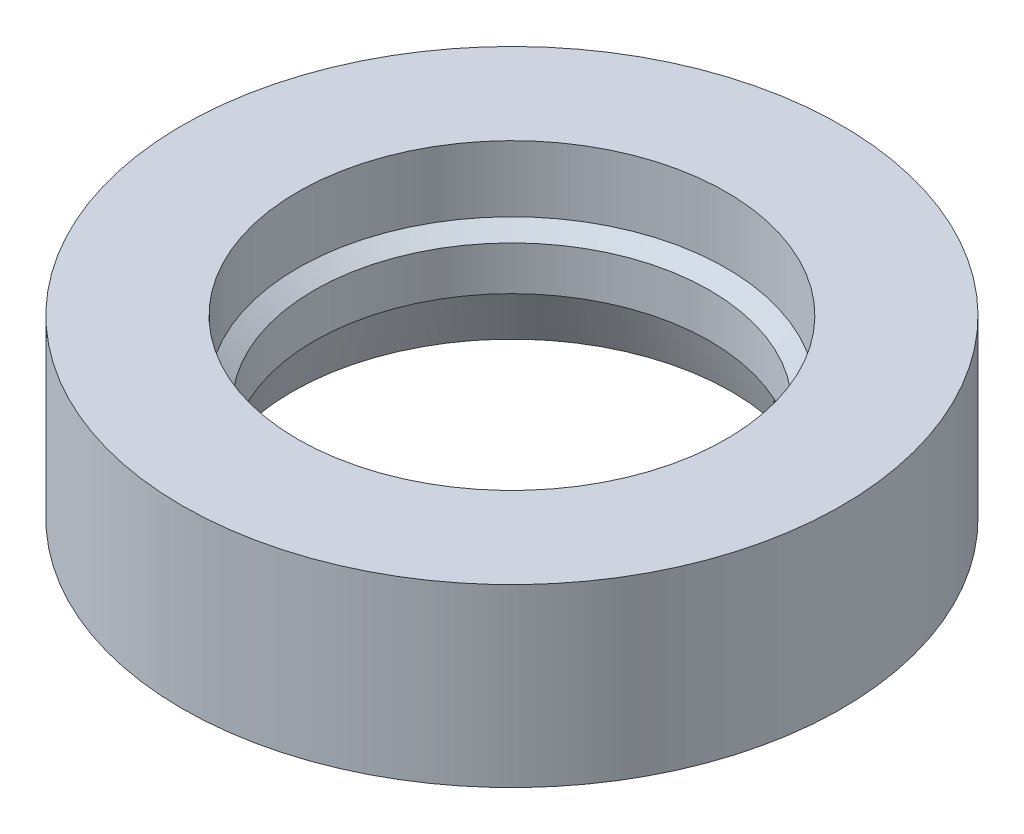
ISO-10303-21;
HEADER;
FILE_DESCRIPTION(('STEP AP214'),'2;1');
FILE_NAME('part.step','',(''),(''),'','','');
FILE_SCHEMA(('AUTOMOTIVE_DESIGN { 1 0 10303 214 1 1 1 1 }'));
ENDSEC;
DATA;
#1=APPLICATION_CONTEXT('core data for automotive mechanical design processes');
#2=APPLICATION_PROTOCOL_DEFINITION('international standard','automotive_design',2000,#1);
#3=PRODUCT_CONTEXT('',#1,'mechanical');
#4=PRODUCT('Part','Part','',(#3));
#5=PRODUCT_RELATED_PRODUCT_CATEGORY('part','',(#4));
#6=PRODUCT_DEFINITION_FORMATION('','',#4);
#7=PRODUCT_DEFINITION_CONTEXT('part definition',#1,'design');
#8=PRODUCT_DEFINITION('design','',#6,#7);
#9=PRODUCT_DEFINITION_SHAPE('','',#8);
#10=(LENGTH_UNIT() NAMED_UNIT(*) SI_UNIT(.MILLI.,.METRE.));
#11=(NAMED_UNIT(*) PLANE_ANGLE_UNIT() SI_UNIT($,.RADIAN.));
#12=(NAMED_UNIT(*) SI_UNIT($,.STERADIAN.) SOLID_ANGLE_UNIT());
#13=UNCERTAINTY_MEASURE_WITH_UNIT(LENGTH_MEASURE(1.E-05),#10,'distance_accuracy_value','');
#14=(GEOMETRIC_REPRESENTATION_CONTEXT(3) GLOBAL_UNCERTAINTY_ASSIGNED_CONTEXT((#13)) GLOBAL_UNIT_ASSIGNED_CONTEXT((#10,
#11,#12)) REPRESENTATION_CONTEXT('',''));
#15=CARTESIAN_POINT('',(0.,0.,0.));
#16=DIRECTION('',(0.,0.,1.));
#17=DIRECTION('',(1.,0.,0.));
#18=AXIS2_PLACEMENT_3D('',#15,#16,#17);
#19=CARTESIAN_POINT('',(0.,-4.38875643120586,-8.94082433252345));
#20=DIRECTION('',(0.,-1.,0.));
#21=DIRECTION('',(0.,0.,-1.));
#22=AXIS2_PLACEMENT_3D('',#19,#20,#21);
#23=CONICAL_SURFACE('',#22,13.4999999882875,1.57076719882173);
#24=CARTESIAN_POINT('',(0.,-4.38880012316596,-8.94082433252345));
#25=DIRECTION('',(0.,1.,0.));
#26=DIRECTION('',(0.,0.,1.));
#27=AXIS2_PLACEMENT_3D('',#24,#25,#26);
#28=CIRCLE('',#27,15.);
#29=CARTESIAN_POINT('',(0.,-4.38880012316596,6.05917566747655));
#30=VERTEX_POINT('',#29);
#31=EDGE_CURVE('E91',#30,#30,#28,.T.);
#32=ORIENTED_EDGE('',*,*,#31,.F.);
#33=EDGE_LOOP('',(#32));
#34=FACE_BOUND('',#33,.T.);
#35=CARTESIAN_POINT('',(0.,-4.38875643120586,-8.94082433252345));
#36=DIRECTION('',(0.,1.,0.));
#37=DIRECTION('',(0.,0.,1.));
#38=AXIS2_PLACEMENT_3D('',#35,#36,#37);
#39=CIRCLE('',#38,13.4999999882875);
#40=CARTESIAN_POINT('',(0.,-4.38875643120586,4.55917565576407));
#41=VERTEX_POINT('',#40);
#42=EDGE_CURVE('E10',#41,#41,#39,.T.);
#43=ORIENTED_EDGE('',*,*,#42,.T.);
#44=EDGE_LOOP('',(#43));
#45=FACE_BOUND('',#44,.T.);
#46=ADVANCED_FACE('F39',(#34,#45),#23,.F.);
#47=CARTESIAN_POINT('',(0.,4.11119987683404,-8.94082433252345));
#48=DIRECTION('',(0.,1.,0.));
#49=DIRECTION('',(0.,0.,1.));
#50=AXIS2_PLACEMENT_3D('',#47,#48,#49);
#51=CYLINDRICAL_SURFACE('',#50,13.4999999882875);
#52=ORIENTED_EDGE('',*,*,#42,.F.);
#53=EDGE_LOOP('',(#52));
#54=FACE_BOUND('',#53,.T.);
#55=CARTESIAN_POINT('',(0.,-2.88875643120586,-8.94082433252345));
#56=DIRECTION('',(0.,1.,0.));
#57=DIRECTION('',(0.,0.,1.));
#58=AXIS2_PLACEMENT_3D('',#55,#56,#57);
#59=CIRCLE('',#58,13.4999999882875);
#60=CARTESIAN_POINT('',(0.,-2.88875643120587,4.55917565576407));
#61=VERTEX_POINT('',#60);
#62=EDGE_CURVE('E52',#61,#61,#59,.T.);
#63=ORIENTED_EDGE('',*,*,#62,.T.);
#64=EDGE_LOOP('',(#63));
#65=FACE_BOUND('',#64,.T.);
#66=ADVANCED_FACE('F137',(#54,#65),#51,.F.);
#67=CARTESIAN_POINT('',(0.,-2.8885674599527,-8.94082433252345));
#68=DIRECTION('',(0.,-1.,0.));
#69=DIRECTION('',(0.,0.,-1.));
#70=AXIS2_PLACEMENT_3D('',#67,#68,#69);
#71=CONICAL_SURFACE('',#70,12.0000000001909,1.57067034595912);
#72=ORIENTED_EDGE('',*,*,#62,.F.);
#73=EDGE_LOOP('',(#72));
#74=FACE_BOUND('',#73,.T.);
#75=CARTESIAN_POINT('',(0.,-2.8885674599527,-8.94082433252345));
#76=DIRECTION('',(0.,1.,0.));
#77=DIRECTION('',(0.,0.,1.));
#78=AXIS2_PLACEMENT_3D('',#75,#76,#77);
#79=CIRCLE('',#78,12.0000000001909);
#80=CARTESIAN_POINT('',(0.,-2.8885674599527,3.05917566766745));
#81=VERTEX_POINT('',#80);
#82=EDGE_CURVE('E57',#81,#81,#79,.T.);
#83=ORIENTED_EDGE('',*,*,#82,.T.);
#84=EDGE_LOOP('',(#83));
#85=FACE_BOUND('',#84,.T.);
#86=ADVANCED_FACE('F142',(#74,#85),#71,.F.);
#87=CARTESIAN_POINT('',(0.,4.11119987683404,-8.94082433252345));
#88=DIRECTION('',(0.,1.,0.));
#89=DIRECTION('',(0.,0.,1.));
#90=AXIS2_PLACEMENT_3D('',#87,#88,#89);
#91=CYLINDRICAL_SURFACE('',#90,12.0000000001909);
#92=ORIENTED_EDGE('',*,*,#82,.F.);
#93=EDGE_LOOP('',(#92));
#94=FACE_BOUND('',#93,.T.);
#95=CARTESIAN_POINT('',(0.,-4.38875643120586,-8.94082433252345));
#96=DIRECTION('',(0.,1.,0.));
#97=DIRECTION('',(0.,0.,1.));
#98=AXIS2_PLACEMENT_3D('',#95,#96,#97);
#99=CIRCLE('',#98,12.0000000001909);
#100=CARTESIAN_POINT('',(0.,-4.38875643120587,3.05917566766745));
#101=VERTEX_POINT('',#100);
#102=EDGE_CURVE('E63',#101,#101,#99,.T.);
#103=ORIENTED_EDGE('',*,*,#102,.T.);
#104=EDGE_LOOP('',(#103));
#105=FACE_BOUND('',#104,.T.);
#106=ADVANCED_FACE('F152',(#94,#105),#91,.T.);
#107=CARTESIAN_POINT('',(0.,-4.38875643120586,0.));
#108=DIRECTION('',(0.,-1.,0.));
#109=DIRECTION('',(0.,0.,-1.));
#110=AXIS2_PLACEMENT_3D('',#107,#108,#109);
#111=PLANE('',#110);
#112=CARTESIAN_POINT('',(0.,-4.38875643120586,-8.94082433252345));
#113=DIRECTION('',(0.,1.,0.));
#114=DIRECTION('',(0.,0.,1.));
#115=AXIS2_PLACEMENT_3D('',#112,#113,#114);
#116=CIRCLE('',#115,10.0000000001909);
#117=CARTESIAN_POINT('',(0.,-4.38875643120587,1.05917566766745));
#118=VERTEX_POINT('',#117);
#119=EDGE_CURVE('E67',#118,#118,#116,.T.);
#120=ORIENTED_EDGE('',*,*,#119,.T.);
#121=EDGE_LOOP('',(#120));
#122=FACE_BOUND('',#121,.T.);
#123=ORIENTED_EDGE('',*,*,#102,.F.);
#124=EDGE_LOOP('',(#123));
#125=FACE_BOUND('',#124,.T.);
#126=ADVANCED_FACE('F133',(#122,#125),#111,.T.);
#127=CARTESIAN_POINT('',(0.,-1.88880012316596,-8.94082433252345));
#128=DIRECTION('',(0.,-1.,0.));
#129=DIRECTION('',(0.,0.,-1.));
#130=AXIS2_PLACEMENT_3D('',#127,#128,#129);
#131=CONICAL_SURFACE('',#130,9.,0.380512403746244);
#132=CARTESIAN_POINT('',(3.60521380359981,-3.25606348854737,-17.7808479300959));
#133=CARTESIAN_POINT('',(3.5722960162441,-3.22985006701116,-17.7829487183023));
#134=CARTESIAN_POINT('',(3.54107109716125,-3.20133270234858,-17.7831970978233));
#135=CARTESIAN_POINT('',(3.4830259392722,-3.14027071831476,-17.7799743117197));
#136=CARTESIAN_POINT('',(3.45620795493594,-3.1077240524958,-17.776501249095));
#137=CARTESIAN_POINT('',(3.40788662500359,-3.03933037286945,-17.7659306264314));
#138=CARTESIAN_POINT('',(3.38639268425284,-3.00347767010928,-17.7588267193997));
#139=CARTESIAN_POINT('',(3.34959174006562,-2.92950441102249,-17.7412182412557));
#140=CARTESIAN_POINT('',(3.33428332126447,-2.89138437579735,-17.7307144490933));
#141=CARTESIAN_POINT('',(3.31084107888016,-2.81530937322336,-17.7070499243428));
#142=CARTESIAN_POINT('',(3.30248368492487,-2.77739181241254,-17.6939902065533));
#143=CARTESIAN_POINT('',(3.29239486206503,-2.70160983768472,-17.6653975638346));
#144=CARTESIAN_POINT('',(3.29066249157888,-2.66374541697991,-17.6498649906868));
#145=CARTESIAN_POINT('',(3.29382695040736,-2.59004073796155,-17.6171401456215));
#146=CARTESIAN_POINT('',(3.29857683599177,-2.55417417175271,-17.5999925998683));
#147=CARTESIAN_POINT('',(3.31424225479886,-2.48460374373134,-17.564202158554));
#148=CARTESIAN_POINT('',(3.32515765266112,-2.45089983445698,-17.5455592958295));
#149=CARTESIAN_POINT('',(3.35282558720657,-2.38636200885827,-17.5070998530652));
#150=CARTESIAN_POINT('',(3.36961757807255,-2.35554932288986,-17.4872761107445));
#151=CARTESIAN_POINT('',(3.40840577979478,-2.29785282968952,-17.4470232618525));
#152=CARTESIAN_POINT('',(3.43040262094043,-2.27096949892726,-17.426594082227));
#153=CARTESIAN_POINT('',(3.479723096221,-2.22086912473486,-17.384821286635));
#154=CARTESIAN_POINT('',(3.50720927241094,-2.19781784115424,-17.3634711218032));
#155=CARTESIAN_POINT('',(3.56605462295831,-2.15706695190576,-17.3210137229521));
#156=CARTESIAN_POINT('',(3.5974147369954,-2.13936864828483,-17.2999065492365));
#157=CARTESIAN_POINT('',(3.66508839416465,-2.10868657625881,-17.2570573222084));
#158=CARTESIAN_POINT('',(3.70158749234376,-2.09605678065152,-17.2353552309441));
#159=CARTESIAN_POINT('',(3.77683222630247,-2.07724289309385,-17.1930895957839));
#160=CARTESIAN_POINT('',(3.81557860267861,-2.07106093893445,-17.1725264316392));
#161=CARTESIAN_POINT('',(3.89724032854926,-2.06487855722807,-17.1314593269132));
#162=CARTESIAN_POINT('',(3.94025193120668,-2.06536975774695,-17.1110725226392));
#163=CARTESIAN_POINT('',(4.0265889116155,-2.07354310710154,-17.0725185986365));
#164=CARTESIAN_POINT('',(4.06991439662804,-2.08122784147264,-17.0543522796599));
#165=CARTESIAN_POINT('',(4.15840030131205,-2.10417672861993,-17.0197001315639));
#166=CARTESIAN_POINT('',(4.20351579901029,-2.1198660866337,-17.0033794336339));
#167=CARTESIAN_POINT('',(4.29172438670234,-2.15860681132561,-16.9743472498999));
#168=CARTESIAN_POINT('',(4.33481691832885,-2.18166019703529,-16.9616367557308));
#169=CARTESIAN_POINT('',(4.4179055549569,-2.23474719472202,-16.9404403437959));
#170=CARTESIAN_POINT('',(4.45788777403554,-2.26480995386614,-16.9319725446787));
#171=CARTESIAN_POINT('',(4.53315676847666,-2.33119385724924,-16.9200707486792));
#172=CARTESIAN_POINT('',(4.56844564829156,-2.36751217966798,-16.916634488733));
#173=CARTESIAN_POINT('',(4.63024712577263,-2.44234223123853,-16.9155398437197));
#174=CARTESIAN_POINT('',(4.65723231111677,-2.48045525643696,-16.9174472698744));
#175=CARTESIAN_POINT('',(4.70461519884747,-2.55999923635323,-16.9265448082225));
#176=CARTESIAN_POINT('',(4.72502046563867,-2.60142631226716,-16.9337288229639));
#177=CARTESIAN_POINT('',(4.75604148123258,-2.68075727110921,-16.9522336569561));
#178=CARTESIAN_POINT('',(4.76756122241603,-2.71845551362213,-16.962926219022));
#179=CARTESIAN_POINT('',(4.78415211029607,-2.79396176190956,-16.9882005181369));
#180=CARTESIAN_POINT('',(4.78922673991959,-2.8317696973245,-17.0027801494619));
#181=CARTESIAN_POINT('',(4.79260094244242,-2.9032234215196,-17.0340092567833));
#182=CARTESIAN_POINT('',(4.79141013629847,-2.93696018147097,-17.0503997661247));
#183=CARTESIAN_POINT('',(4.78354987314277,-3.00254109247352,-17.0854759312719));
#184=CARTESIAN_POINT('',(4.7768803618086,-3.03438522475557,-17.1041616098332));
#185=CARTESIAN_POINT('',(4.7582715909464,-3.09590332513789,-17.1434833478229));
#186=CARTESIAN_POINT('',(4.74625483815285,-3.1255376080959,-17.1641444443425));
#187=CARTESIAN_POINT('',(4.71744479431005,-3.18154844797004,-17.2065122280991));
#188=CARTESIAN_POINT('',(4.70065005047665,-3.20792401054382,-17.228219231682));
#189=CARTESIAN_POINT('',(4.66120499803077,-3.25918043389984,-17.2739770285532));
#190=CARTESIAN_POINT('',(4.6381720875391,-3.28373102279509,-17.2980672906398));
#191=CARTESIAN_POINT('',(4.58787538107968,-3.32823415604579,-17.3460704893925));
#192=CARTESIAN_POINT('',(4.56060971463312,-3.34818465786307,-17.3699833427419));
#193=CARTESIAN_POINT('',(4.49941052681739,-3.38520037348941,-17.4195927010148));
#194=CARTESIAN_POINT('',(4.46507461567191,-3.40171857194587,-17.4452016489679));
#195=CARTESIAN_POINT('',(4.39301111315592,-3.42870134232232,-17.4947849815286));
#196=CARTESIAN_POINT('',(4.35528224145014,-3.43916361786869,-17.5187587430464));
#197=CARTESIAN_POINT('',(4.27427099480893,-3.45448918021788,-17.5662728338191));
#198=CARTESIAN_POINT('',(4.2307852061185,-3.4588476716524,-17.5896309403345));
#199=CARTESIAN_POINT('',(4.14207723934625,-3.46025787373497,-17.6330887842173));
#200=CARTESIAN_POINT('',(4.0968543267535,-3.45730645928473,-17.6531871240702));
#201=CARTESIAN_POINT('',(4.00512188757526,-3.44391933691021,-17.6898519965878));
#202=CARTESIAN_POINT('',(3.95860378650795,-3.43335137064212,-17.7063493106403));
#203=CARTESIAN_POINT('',(3.86655846396182,-3.40464041961366,-17.7347941086312));
#204=CARTESIAN_POINT('',(3.82102998957642,-3.38650768037412,-17.7467477047655));
#205=CARTESIAN_POINT('',(3.74666183546142,-3.34990094390211,-17.7626800646581));
#206=CARTESIAN_POINT('',(3.71712853146858,-3.33337819637564,-17.7679863069269));
#207=CARTESIAN_POINT('',(3.6597631952857,-3.2970970502034,-17.7762175325353));
#208=CARTESIAN_POINT('',(3.63193091468719,-3.27733912556378,-17.7791428643429));
#209=CARTESIAN_POINT('',(3.60521380359981,-3.25606348854737,-17.7808479300959));
#210=B_SPLINE_CURVE_WITH_KNOTS('',3,(#132,#133,#134,#135,#136,#137,#138,#139,#140,#141,#142,
#143,#144,#145,#146,#147,#148,#149,#150,#151,#152,#153,#154,#155,#156,#157,#158,#159,#160,#161,
#162,#163,#164,#165,#166,#167,#168,#169,#170,#171,#172,#173,#174,#175,#176,#177,#178,#179,#180,
#181,#182,#183,#184,#185,#186,#187,#188,#189,#190,#191,#192,#193,#194,#195,#196,#197,#198,#199,
#200,#201,#202,#203,#204,#205,#206,#207,#208,#209),.UNSPECIFIED.,.T.,.F.,(4,2,2,2,2,2,2,2,2,2,2,
2,2,2,2,2,2,2,2,2,2,2,2,2,2,2,2,2,2,2,2,2,2,2,2,2,2,2,4),(0.,0.126282146055199,
0.252628694905554,0.379196866418866,0.505736060311959,0.628027931383047,0.750302421073328,
0.869850673647642,0.989396301707964,1.10976043813838,1.23013915771637,1.35482855521702,
1.4795482575435,1.61188549015582,1.74426658543163,1.88645027468897,2.02868508793927,
2.17941351962661,2.33018331278836,2.48159160216895,2.63293177084531,2.77233970138509,
2.91158678965704,3.03345366538177,3.15525465640116,3.26730964710614,3.37936574887168,
3.49310153579587,3.60687194197122,3.73055151752459,3.85428590418363,3.9914300189902,
4.12862610410179,4.27660730406343,4.4246517792056,4.57533090524869,4.72580661475423,
4.82831618045466,4.93081074025151),.UNSPECIFIED.);
#211=CARTESIAN_POINT('',(3.60521380359981,-3.25606348854737,-17.7808479300959));
#212=VERTEX_POINT('',#211);
#213=EDGE_CURVE('E95',#212,#212,#210,.T.);
#214=ORIENTED_EDGE('',*,*,#213,.T.);
#215=EDGE_LOOP('',(#214));
#216=FACE_BOUND('',#215,.T.);
#217=ORIENTED_EDGE('',*,*,#119,.F.);
#218=EDGE_LOOP('',(#217));
#219=FACE_BOUND('',#218,.T.);
#220=CARTESIAN_POINT('',(0.,-1.88880012316596,-8.94082433252345));
#221=DIRECTION('',(0.,1.,0.));
#222=DIRECTION('',(0.,0.,1.));
#223=AXIS2_PLACEMENT_3D('',#220,#221,#222);
#224=CIRCLE('',#223,9.);
#225=CARTESIAN_POINT('',(0.,-1.88880012316596,0.0591756674765513));
#226=VERTEX_POINT('',#225);
#227=EDGE_CURVE('E71',#226,#226,#224,.T.);
#228=ORIENTED_EDGE('',*,*,#227,.T.);
#229=EDGE_LOOP('',(#228));
#230=FACE_BOUND('',#229,.T.);
#231=ADVANCED_FACE('F102',(#216,#219,#230),#131,.F.);
#232=CARTESIAN_POINT('',(0.,4.11119987683404,-8.94082433252345));
#233=DIRECTION('',(0.,1.,0.));
#234=DIRECTION('',(0.,0.,1.));
#235=AXIS2_PLACEMENT_3D('',#232,#233,#234);
#236=CYLINDRICAL_SURFACE('',#235,9.);
#237=CARTESIAN_POINT('',(0.,0.111199876834038,-8.94082433252345));
#238=DIRECTION('',(0.,1.,0.));
#239=DIRECTION('',(0.,0.,1.));
#240=AXIS2_PLACEMENT_3D('',#237,#238,#239);
#241=CIRCLE('',#240,9.);
#242=CARTESIAN_POINT('',(0.,0.111199876834036,0.0591756674765513));
#243=VERTEX_POINT('',#242);
#244=EDGE_CURVE('E75',#243,#243,#241,.T.);
#245=ORIENTED_EDGE('',*,*,#244,.T.);
#246=EDGE_LOOP('',(#245));
#247=FACE_BOUND('',#246,.T.);
#248=ORIENTED_EDGE('',*,*,#227,.F.);
#249=EDGE_LOOP('',(#248));
#250=FACE_BOUND('',#249,.T.);
#251=ADVANCED_FACE('F126',(#247,#250),#236,.F.);
#252=CARTESIAN_POINT('',(0.,0.611199876834037,-8.94082433252345));
#253=DIRECTION('',(0.,1.,0.));
#254=DIRECTION('',(0.,0.,1.));
#255=AXIS2_PLACEMENT_3D('',#252,#253,#254);
#256=CONICAL_SURFACE('',#255,9.75,0.982793723247328);
#257=ORIENTED_EDGE('',*,*,#244,.F.);
#258=EDGE_LOOP('',(#257));
#259=FACE_BOUND('',#258,.T.);
#260=CARTESIAN_POINT('',(0.,0.611199876834037,-8.94082433252345));
#261=DIRECTION('',(0.,1.,0.));
#262=DIRECTION('',(0.,0.,1.));
#263=AXIS2_PLACEMENT_3D('',#260,#261,#262);
#264=CIRCLE('',#263,9.75);
#265=CARTESIAN_POINT('',(0.,0.611199876834035,0.809175667476548));
#266=VERTEX_POINT('',#265);
#267=EDGE_CURVE('E79',#266,#266,#264,.T.);
#268=ORIENTED_EDGE('',*,*,#267,.T.);
#269=EDGE_LOOP('',(#268));
#270=FACE_BOUND('',#269,.T.);
#271=ADVANCED_FACE('F123',(#259,#270),#256,.F.);
#272=CARTESIAN_POINT('',(0.,4.11119987683404,-8.94082433252345));
#273=DIRECTION('',(0.,1.,0.));
#274=DIRECTION('',(0.,0.,1.));
#275=AXIS2_PLACEMENT_3D('',#272,#273,#274);
#276=CYLINDRICAL_SURFACE('',#275,9.75);
#277=CARTESIAN_POINT('',(0.,3.61119987683404,-8.94082433252345));
#278=DIRECTION('',(0.,1.,0.));
#279=DIRECTION('',(0.,0.,1.));
#280=AXIS2_PLACEMENT_3D('',#277,#278,#279);
#281=CIRCLE('',#280,9.75);
#282=CARTESIAN_POINT('',(0.,3.61119987683403,0.809175667476548));
#283=VERTEX_POINT('',#282);
#284=EDGE_CURVE('E83',#283,#283,#281,.T.);
#285=ORIENTED_EDGE('',*,*,#284,.T.);
#286=EDGE_LOOP('',(#285));
#287=FACE_BOUND('',#286,.T.);
#288=ORIENTED_EDGE('',*,*,#267,.F.);
#289=EDGE_LOOP('',(#288));
#290=FACE_BOUND('',#289,.T.);
#291=ADVANCED_FACE('F119',(#287,#290),#276,.F.);
#292=CARTESIAN_POINT('',(0.,3.61119987683404,0.));
#293=DIRECTION('',(0.,-1.,0.));
#294=DIRECTION('',(0.,0.,-1.));
#295=AXIS2_PLACEMENT_3D('',#292,#293,#294);
#296=PLANE('',#295);
#297=ORIENTED_EDGE('',*,*,#284,.F.);
#298=EDGE_LOOP('',(#297));
#299=FACE_BOUND('',#298,.T.);
#300=CARTESIAN_POINT('',(0.,3.61119987683404,-8.94082433252345));
#301=DIRECTION('',(0.,1.,0.));
#302=DIRECTION('',(0.,0.,1.));
#303=AXIS2_PLACEMENT_3D('',#300,#301,#302);
#304=CIRCLE('',#303,15.);
#305=CARTESIAN_POINT('',(0.,3.61119987683403,6.05917566747655));
#306=VERTEX_POINT('',#305);
#307=EDGE_CURVE('E87',#306,#306,#304,.T.);
#308=ORIENTED_EDGE('',*,*,#307,.T.);
#309=EDGE_LOOP('',(#308));
#310=FACE_BOUND('',#309,.T.);
#311=ADVANCED_FACE('F115',(#299,#310),#296,.F.);
#312=CARTESIAN_POINT('',(0.,4.11119987683404,-8.94082433252345));
#313=DIRECTION('',(0.,1.,0.));
#314=DIRECTION('',(0.,0.,1.));
#315=AXIS2_PLACEMENT_3D('',#312,#313,#314);
#316=CYLINDRICAL_SURFACE('',#315,15.);
#317=CARTESIAN_POINT('',(4.04168476131872,-1.16481948438962,-23.3860582970574));
#318=CARTESIAN_POINT('',(3.99715748534741,-1.15983379041276,-23.3985164149504));
#319=CARTESIAN_POINT('',(3.952950179524,-1.15069034328982,-23.4106610628144));
#320=CARTESIAN_POINT('',(3.86651950958102,-1.12473244426191,-23.4339966627244));
#321=CARTESIAN_POINT('',(3.82430128563461,-1.10789920420728,-23.4451851987973));
#322=CARTESIAN_POINT('',(3.74316434604422,-1.06741733712497,-23.466335390525));
#323=CARTESIAN_POINT('',(3.70423330859256,-1.04379577046737,-23.4763016976224));
#324=CARTESIAN_POINT('',(3.63041225183744,-0.990551191250208,-23.4949151062174));
#325=CARTESIAN_POINT('',(3.59552053666084,-0.960930711746478,-23.5035627618261));
#326=CARTESIAN_POINT('',(3.52844405114954,-0.894476100627566,-23.5199652736069));
#327=CARTESIAN_POINT('',(3.49657214972287,-0.857303201154414,-23.5276284877913));
#328=CARTESIAN_POINT('',(3.43901582796424,-0.778158402149183,-23.5413054125675));
#329=CARTESIAN_POINT('',(3.41333388417594,-0.736184591688529,-23.5473184630772));
#330=CARTESIAN_POINT('',(3.3679700444004,-0.646783972203819,-23.5578467260342));
#331=CARTESIAN_POINT('',(3.34856793308609,-0.599206542935505,-23.5622927255258));
#332=CARTESIAN_POINT('',(3.31790000631905,-0.501351205445987,-23.5692825242727));
#333=CARTESIAN_POINT('',(3.30663486422323,-0.451073074103948,-23.5718261661032));
#334=CARTESIAN_POINT('',(3.29291947162132,-0.349843688914721,-23.5749191594174));
#335=CARTESIAN_POINT('',(3.29036910081157,-0.298906876377835,-23.5754911628878));
#336=CARTESIAN_POINT('',(3.29427564050097,-0.197378780005458,-23.5746124260217));
#337=CARTESIAN_POINT('',(3.3007297137655,-0.146787392375877,-23.5731623228364));
#338=CARTESIAN_POINT('',(3.32216122408066,-0.0511300191310344,-23.5683106161468));
#339=CARTESIAN_POINT('',(3.33653145347852,-0.00592192287801247,-23.5650479114593));
#340=CARTESIAN_POINT('',(3.37330043175731,0.0809160975971923,-23.5566102624763));
#341=CARTESIAN_POINT('',(3.39569256791636,0.12254893408347,-23.5514368930963));
#342=CARTESIAN_POINT('',(3.44532194615603,0.196355228708634,-23.5398082977476));
#343=CARTESIAN_POINT('',(3.47181006524871,0.229062412725295,-23.5335430939693));
#344=CARTESIAN_POINT('',(3.53018608574697,0.288852283208338,-23.5195308005199));
#345=CARTESIAN_POINT('',(3.56207008396033,0.315939004016546,-23.511784781498));
#346=CARTESIAN_POINT('',(3.62708832956252,0.361237639491231,-23.4957288778941));
#347=CARTESIAN_POINT('',(3.65984710704387,0.380031545885923,-23.487533796578));
#348=CARTESIAN_POINT('',(3.72795271989141,0.411499278594335,-23.4702290125529));
#349=CARTESIAN_POINT('',(3.76329901915919,0.424174368531732,-23.4611194991571));
#350=CARTESIAN_POINT('',(3.83453714268682,0.442907008566394,-23.4424671883118));
#351=CARTESIAN_POINT('',(3.87039105094988,0.449127641521074,-23.4329417527094));
#352=CARTESIAN_POINT('',(3.94251688176337,0.45558682098797,-23.4134867256771));
#353=CARTESIAN_POINT('',(3.97878887203475,0.455824384342015,-23.4035570680926));
#354=CARTESIAN_POINT('',(4.05277250169847,0.450459069805862,-23.3830051205765));
#355=CARTESIAN_POINT('',(4.09045867195179,0.444546267924414,-23.37237399597));
#356=CARTESIAN_POINT('',(4.16445872439682,0.426901836332239,-23.3511944869714));
#357=CARTESIAN_POINT('',(4.20077206421788,0.415167932179203,-23.3406461365589));
#358=CARTESIAN_POINT('',(4.27522569288624,0.384881841402722,-23.3187279110352));
#359=CARTESIAN_POINT('',(4.3131296460282,0.365723066125985,-23.3073947946623));
#360=CARTESIAN_POINT('',(4.38571423709911,0.321755785093477,-23.2854035356359));
#361=CARTESIAN_POINT('',(4.4203932624081,0.296944473961716,-23.274745731511));
#362=CARTESIAN_POINT('',(4.49003543641535,0.239057493081809,-23.2530942765384));
#363=CARTESIAN_POINT('',(4.52450309872991,0.205339181072219,-23.2422221596366));
#364=CARTESIAN_POINT('',(4.58801538768452,0.132732568186153,-23.2219737473441));
#365=CARTESIAN_POINT('',(4.61705730432869,0.0938417002871478,-23.2125981997829));
#366=CARTESIAN_POINT('',(4.67125073987131,0.00845243717444273,-23.1949569192475));
#367=CARTESIAN_POINT('',(4.69588388022057,-0.0384088443328122,-23.1868464830799));
#368=CARTESIAN_POINT('',(4.73727346143935,-0.135857967343576,-23.173136799168));
#369=CARTESIAN_POINT('',(4.75402811791874,-0.186446650064436,-23.1675381203223));
#370=CARTESIAN_POINT('',(4.77871785150406,-0.28959704929958,-23.1592639853248));
#371=CARTESIAN_POINT('',(4.78671643715945,-0.342141660953521,-23.1565674818786));
#372=CARTESIAN_POINT('',(4.79326514086045,-0.447901475569534,-23.1543610361601));
#373=CARTESIAN_POINT('',(4.79182171049369,-0.501116195847717,-23.1548489180445));
#374=CARTESIAN_POINT('',(4.77946703447292,-0.600972116858028,-23.1590074146225));
#375=CARTESIAN_POINT('',(4.76950679958289,-0.647742721283678,-23.162358308339));
#376=CARTESIAN_POINT('',(4.74116609011526,-0.738361827696004,-23.1718315649389));
#377=CARTESIAN_POINT('',(4.7227947779833,-0.782213450035839,-23.1779509119752));
#378=CARTESIAN_POINT('',(4.68078792747674,-0.859762798684939,-23.1918118153521));
#379=CARTESIAN_POINT('',(4.65812208676244,-0.894042298246096,-23.1992471071021));
#380=CARTESIAN_POINT('',(4.60716247199014,-0.957649200031335,-23.2157943120668));
#381=CARTESIAN_POINT('',(4.57887205486065,-0.986979536864094,-23.2249052249749));
#382=CARTESIAN_POINT('',(4.51998305027484,-1.03757458916641,-23.2436432797647));
#383=CARTESIAN_POINT('',(4.48974073896493,-1.05929210014685,-23.2531735370152));
#384=CARTESIAN_POINT('',(4.4261254855923,-1.09708375145417,-23.2729742415661));
#385=CARTESIAN_POINT('',(4.39275183530663,-1.11315661119816,-23.2832448561928));
#386=CARTESIAN_POINT('',(4.32391500145751,-1.13932484036859,-23.3041474720666));
#387=CARTESIAN_POINT('',(4.28845459002683,-1.14942795156386,-23.3147789862718));
#388=CARTESIAN_POINT('',(4.21640440996518,-1.16362459771886,-23.336078451316));
#389=CARTESIAN_POINT('',(4.17981604540469,-1.16772531867428,-23.346746343235));
#390=CARTESIAN_POINT('',(4.12622049903463,-1.16944689319232,-23.3621493982445));
#391=CARTESIAN_POINT('',(4.10928498520617,-1.16936865930093,-23.3669841102747));
#392=CARTESIAN_POINT('',(4.07544595042884,-1.16799863237883,-23.3765802831359));
#393=CARTESIAN_POINT('',(4.05854242492742,-1.16670702747607,-23.3813417552062));
#394=CARTESIAN_POINT('',(4.04168476131872,-1.16481948438962,-23.3860582970574));
#395=B_SPLINE_CURVE_WITH_KNOTS('',3,(#317,#318,#319,#320,#321,#322,#323,#324,#325,#326,#327,
#328,#329,#330,#331,#332,#333,#334,#335,#336,#337,#338,#339,#340,#341,#342,#343,#344,#345,#346,
#347,#348,#349,#350,#351,#352,#353,#354,#355,#356,#357,#358,#359,#360,#361,#362,#363,#364,#365,
#366,#367,#368,#369,#370,#371,#372,#373,#374,#375,#376,#377,#378,#379,#380,#381,#382,#383,#384,
#385,#386,#387,#388,#389,#390,#391,#392,#393,#394),.UNSPECIFIED.,.T.,.F.,(4,2,2,2,2,2,2,2,2,2,2,
2,2,2,2,2,2,2,2,2,2,2,2,2,2,2,2,2,2,2,2,2,2,2,2,2,2,2,4),(0.,0.139446386796808,
0.279235314528344,0.418474551631871,0.557655116746728,0.705679219032706,0.853762446421586,
1.00774493654172,1.16174016768299,1.31396015418285,1.46613218810663,1.60799254019665,
1.74973622019763,1.87669326682114,2.00355886660777,2.11892174456299,2.23426078822063,
2.34660885177552,2.45897537662258,2.57729183482854,2.69565455852582,2.82699693008965,
2.95840462995094,3.10606722074386,3.2538033685033,3.41372356541337,3.57367996506804,
3.73246833836085,3.89114822528361,4.03412612459454,4.17694864289572,4.30156329748654,
4.42610380010186,4.54085400170253,4.65563021950062,4.77025726312678,4.88474696395576,
4.93754841424143,4.99034167924116),.UNSPECIFIED.);
#396=CARTESIAN_POINT('',(4.04168476131872,-1.16481948438962,-23.3860582970574));
#397=VERTEX_POINT('',#396);
#398=EDGE_CURVE('E42',#397,#397,#395,.T.);
#399=ORIENTED_EDGE('',*,*,#398,.F.);
#400=EDGE_LOOP('',(#399));
#401=FACE_BOUND('',#400,.T.);
#402=ORIENTED_EDGE('',*,*,#31,.T.);
#403=EDGE_LOOP('',(#402));
#404=FACE_BOUND('',#403,.T.);
#405=ORIENTED_EDGE('',*,*,#307,.F.);
#406=EDGE_LOOP('',(#405));
#407=FACE_BOUND('',#406,.T.);
#408=ADVANCED_FACE('F109',(#401,#404,#407),#316,.T.);
#409=CARTESIAN_POINT('',(4.04168476131872,0.381618550947181,-25.2326794405975));
#410=DIRECTION('',(0.,-0.37139627193644,0.928474452632765));
#411=DIRECTION('',(0.,-0.928474452632766,-0.37139627193644));
#412=AXIS2_PLACEMENT_3D('',#409,#410,#411);
#413=CYLINDRICAL_SURFACE('',#412,0.750000000000001);
#414=ORIENTED_EDGE('',*,*,#398,.T.);
#415=EDGE_LOOP('',(#414));
#416=FACE_BOUND('',#415,.T.);
#417=ORIENTED_EDGE('',*,*,#213,.F.);
#418=EDGE_LOOP('',(#417));
#419=FACE_BOUND('',#418,.T.);
#420=ADVANCED_FACE('F106',(#416,#419),#413,.F.);
#421=CLOSED_SHELL('',(#46,#66,#86,#106,#126,#231,#251,#271,#291,#311,#408,#420));
#422=MANIFOLD_SOLID_BREP('B2',#421);
#423=ADVANCED_BREP_SHAPE_REPRESENTATION('',(#18,#422),#14);
#424=SHAPE_DEFINITION_REPRESENTATION(#9,#423);
ENDSEC;
END-ISO-10303-21;
